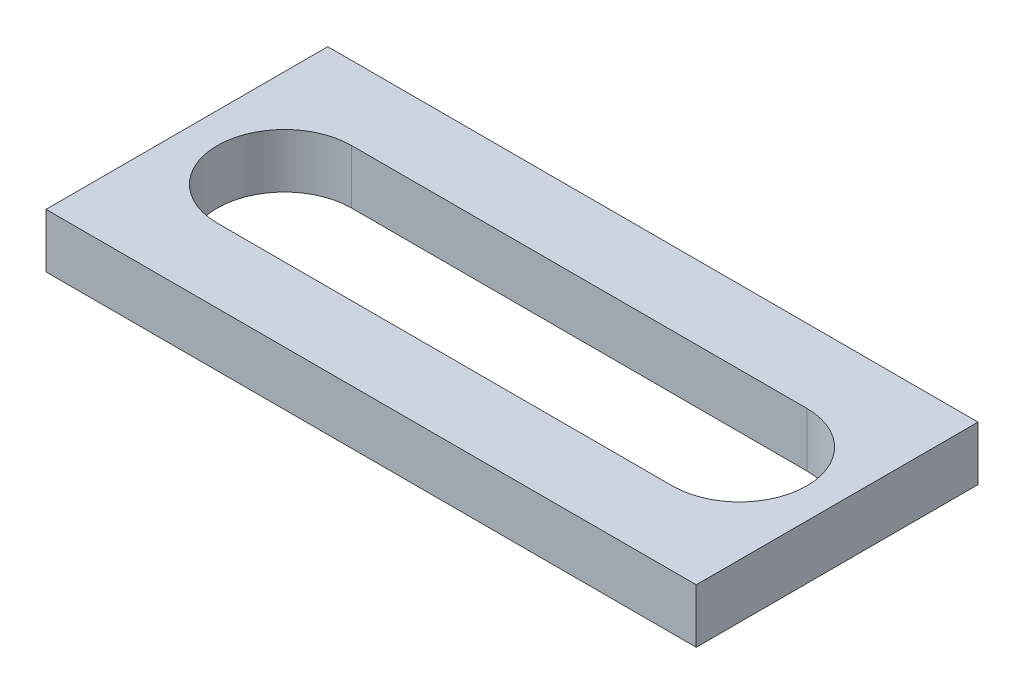
ISO-10303-21;
HEADER;
FILE_DESCRIPTION(('STEP AP214'),'2;1');
FILE_NAME('part.step','',(''),(''),'','','');
FILE_SCHEMA(('AUTOMOTIVE_DESIGN { 1 0 10303 214 1 1 1 1 }'));
ENDSEC;
DATA;
#1=APPLICATION_CONTEXT('core data for automotive mechanical design processes');
#2=APPLICATION_PROTOCOL_DEFINITION('international standard','automotive_design',2000,#1);
#3=PRODUCT_CONTEXT('',#1,'mechanical');
#4=PRODUCT('Part','Part','',(#3));
#5=PRODUCT_RELATED_PRODUCT_CATEGORY('part','',(#4));
#6=PRODUCT_DEFINITION_FORMATION('','',#4);
#7=PRODUCT_DEFINITION_CONTEXT('part definition',#1,'design');
#8=PRODUCT_DEFINITION('design','',#6,#7);
#9=PRODUCT_DEFINITION_SHAPE('','',#8);
#10=(LENGTH_UNIT() NAMED_UNIT(*) SI_UNIT(.MILLI.,.METRE.));
#11=(NAMED_UNIT(*) PLANE_ANGLE_UNIT() SI_UNIT($,.RADIAN.));
#12=(NAMED_UNIT(*) SI_UNIT($,.STERADIAN.) SOLID_ANGLE_UNIT());
#13=UNCERTAINTY_MEASURE_WITH_UNIT(LENGTH_MEASURE(1.E-05),#10,'distance_accuracy_value','');
#14=(GEOMETRIC_REPRESENTATION_CONTEXT(3) GLOBAL_UNCERTAINTY_ASSIGNED_CONTEXT((#13)) GLOBAL_UNIT_ASSIGNED_CONTEXT((#10,
#11,#12)) REPRESENTATION_CONTEXT('',''));
#15=CARTESIAN_POINT('',(0.,0.,0.));
#16=DIRECTION('',(0.,0.,1.));
#17=DIRECTION('',(1.,0.,0.));
#18=AXIS2_PLACEMENT_3D('',#15,#16,#17);
#19=CARTESIAN_POINT('',(0.,2.5,0.));
#20=DIRECTION('',(0.,1.,0.));
#21=DIRECTION('',(0.,0.,1.));
#22=AXIS2_PLACEMENT_3D('',#19,#20,#21);
#23=PLANE('',#22);
#24=DIRECTION('',(0.,0.,-1.));
#25=VECTOR('',#24,1.);
#26=CARTESIAN_POINT('',(15.,2.5,-6.5));
#27=LINE('',#26,#25);
#28=CARTESIAN_POINT('',(15.,2.5,6.5));
#29=VERTEX_POINT('',#28);
#30=CARTESIAN_POINT('',(15.,2.5,-6.5));
#31=VERTEX_POINT('',#30);
#32=EDGE_CURVE('E136',#29,#31,#27,.T.);
#33=ORIENTED_EDGE('',*,*,#32,.T.);
#34=DIRECTION('',(-1.,0.,0.));
#35=VECTOR('',#34,1.);
#36=CARTESIAN_POINT('',(-15.,2.5,-6.5));
#37=LINE('',#36,#35);
#38=CARTESIAN_POINT('',(-15.,2.5,-6.5));
#39=VERTEX_POINT('',#38);
#40=EDGE_CURVE('E139',#31,#39,#37,.T.);
#41=ORIENTED_EDGE('',*,*,#40,.T.);
#42=DIRECTION('',(0.,0.,1.));
#43=VECTOR('',#42,1.);
#44=CARTESIAN_POINT('',(-15.,2.5,-6.5));
#45=LINE('',#44,#43);
#46=CARTESIAN_POINT('',(-15.,2.5,6.5));
#47=VERTEX_POINT('',#46);
#48=EDGE_CURVE('E142',#39,#47,#45,.T.);
#49=ORIENTED_EDGE('',*,*,#48,.T.);
#50=DIRECTION('',(1.,0.,0.));
#51=VECTOR('',#50,1.);
#52=CARTESIAN_POINT('',(-15.,2.5,6.5));
#53=LINE('',#52,#51);
#54=EDGE_CURVE('E144',#47,#29,#53,.T.);
#55=ORIENTED_EDGE('',*,*,#54,.T.);
#56=EDGE_LOOP('',(#33,#41,#49,#55));
#57=FACE_BOUND('',#56,.T.);
#58=DIRECTION('',(1.,0.,0.));
#59=VECTOR('',#58,1.);
#60=CARTESIAN_POINT('',(-10.5,2.5,3.1));
#61=LINE('',#60,#59);
#62=CARTESIAN_POINT('',(-10.5,2.5,3.1));
#63=VERTEX_POINT('',#62);
#64=CARTESIAN_POINT('',(10.5,2.5,3.1));
#65=VERTEX_POINT('',#64);
#66=EDGE_CURVE('E108',#63,#65,#61,.T.);
#67=ORIENTED_EDGE('',*,*,#66,.F.);
#68=CARTESIAN_POINT('',(-10.5,2.5,0.));
#69=DIRECTION('',(0.,1.,0.));
#70=DIRECTION('',(0.,0.,1.));
#71=AXIS2_PLACEMENT_3D('',#68,#69,#70);
#72=CIRCLE('',#71,3.1);
#73=CARTESIAN_POINT('',(-10.5,2.5,-3.1));
#74=VERTEX_POINT('',#73);
#75=EDGE_CURVE('E100',#74,#63,#72,.T.);
#76=ORIENTED_EDGE('',*,*,#75,.F.);
#77=DIRECTION('',(-1.,0.,0.));
#78=VECTOR('',#77,1.);
#79=CARTESIAN_POINT('',(-10.5,2.5,-3.1));
#80=LINE('',#79,#78);
#81=CARTESIAN_POINT('',(10.5,2.5,-3.1));
#82=VERTEX_POINT('',#81);
#83=EDGE_CURVE('E122',#82,#74,#80,.T.);
#84=ORIENTED_EDGE('',*,*,#83,.F.);
#85=CARTESIAN_POINT('',(10.5,2.5,0.));
#86=DIRECTION('',(0.,1.,0.));
#87=DIRECTION('',(0.,0.,1.));
#88=AXIS2_PLACEMENT_3D('',#85,#86,#87);
#89=CIRCLE('',#88,3.1);
#90=EDGE_CURVE('E120',#65,#82,#89,.T.);
#91=ORIENTED_EDGE('',*,*,#90,.F.);
#92=EDGE_LOOP('',(#67,#76,#84,#91));
#93=FACE_BOUND('',#92,.T.);
#94=ADVANCED_FACE('F35',(#57,#93),#23,.T.);
#95=CARTESIAN_POINT('',(0.,0.,0.));
#96=DIRECTION('',(0.,1.,0.));
#97=DIRECTION('',(0.,0.,1.));
#98=AXIS2_PLACEMENT_3D('',#95,#96,#97);
#99=PLANE('',#98);
#100=DIRECTION('',(0.,0.,-1.));
#101=VECTOR('',#100,1.);
#102=CARTESIAN_POINT('',(15.,0.,-6.5));
#103=LINE('',#102,#101);
#104=CARTESIAN_POINT('',(15.,0.,6.5));
#105=VERTEX_POINT('',#104);
#106=CARTESIAN_POINT('',(15.,0.,-6.5));
#107=VERTEX_POINT('',#106);
#108=EDGE_CURVE('E116',#105,#107,#103,.T.);
#109=ORIENTED_EDGE('',*,*,#108,.F.);
#110=DIRECTION('',(1.,0.,0.));
#111=VECTOR('',#110,1.);
#112=CARTESIAN_POINT('',(-15.,0.,6.5));
#113=LINE('',#112,#111);
#114=CARTESIAN_POINT('',(-15.,0.,6.5));
#115=VERTEX_POINT('',#114);
#116=EDGE_CURVE('E140',#115,#105,#113,.T.);
#117=ORIENTED_EDGE('',*,*,#116,.F.);
#118=DIRECTION('',(0.,0.,1.));
#119=VECTOR('',#118,1.);
#120=CARTESIAN_POINT('',(-15.,0.,-6.5));
#121=LINE('',#120,#119);
#122=CARTESIAN_POINT('',(-15.,0.,-6.5));
#123=VERTEX_POINT('',#122);
#124=EDGE_CURVE('E151',#123,#115,#121,.T.);
#125=ORIENTED_EDGE('',*,*,#124,.F.);
#126=DIRECTION('',(-1.,0.,0.));
#127=VECTOR('',#126,1.);
#128=CARTESIAN_POINT('',(-15.,0.,-6.5));
#129=LINE('',#128,#127);
#130=EDGE_CURVE('E149',#107,#123,#129,.T.);
#131=ORIENTED_EDGE('',*,*,#130,.F.);
#132=EDGE_LOOP('',(#109,#117,#125,#131));
#133=FACE_BOUND('',#132,.T.);
#134=CARTESIAN_POINT('',(-10.5,0.,0.));
#135=DIRECTION('',(0.,1.,0.));
#136=DIRECTION('',(0.,0.,1.));
#137=AXIS2_PLACEMENT_3D('',#134,#135,#136);
#138=CIRCLE('',#137,3.1);
#139=CARTESIAN_POINT('',(-10.5,0.,-3.1));
#140=VERTEX_POINT('',#139);
#141=CARTESIAN_POINT('',(-10.5,0.,3.1));
#142=VERTEX_POINT('',#141);
#143=EDGE_CURVE('E58',#140,#142,#138,.T.);
#144=ORIENTED_EDGE('',*,*,#143,.T.);
#145=DIRECTION('',(1.,0.,0.));
#146=VECTOR('',#145,1.);
#147=CARTESIAN_POINT('',(-10.5,0.,3.1));
#148=LINE('',#147,#146);
#149=CARTESIAN_POINT('',(10.5,0.,3.1));
#150=VERTEX_POINT('',#149);
#151=EDGE_CURVE('E115',#142,#150,#148,.T.);
#152=ORIENTED_EDGE('',*,*,#151,.T.);
#153=CARTESIAN_POINT('',(10.5,0.,0.));
#154=DIRECTION('',(0.,1.,0.));
#155=DIRECTION('',(0.,0.,1.));
#156=AXIS2_PLACEMENT_3D('',#153,#154,#155);
#157=CIRCLE('',#156,3.1);
#158=CARTESIAN_POINT('',(10.5,0.,-3.1));
#159=VERTEX_POINT('',#158);
#160=EDGE_CURVE('E128',#150,#159,#157,.T.);
#161=ORIENTED_EDGE('',*,*,#160,.T.);
#162=DIRECTION('',(-1.,0.,0.));
#163=VECTOR('',#162,1.);
#164=CARTESIAN_POINT('',(-10.5,0.,-3.1));
#165=LINE('',#164,#163);
#166=EDGE_CURVE('E109',#159,#140,#165,.T.);
#167=ORIENTED_EDGE('',*,*,#166,.T.);
#168=EDGE_LOOP('',(#144,#152,#161,#167));
#169=FACE_BOUND('',#168,.T.);
#170=ADVANCED_FACE('F169',(#133,#169),#99,.F.);
#171=CARTESIAN_POINT('',(15.,2.5,-6.5));
#172=DIRECTION('',(-1.,0.,0.));
#173=DIRECTION('',(0.,0.,1.));
#174=AXIS2_PLACEMENT_3D('',#171,#172,#173);
#175=PLANE('',#174);
#176=ORIENTED_EDGE('',*,*,#108,.T.);
#177=DIRECTION('',(0.,-1.,0.));
#178=VECTOR('',#177,1.);
#179=CARTESIAN_POINT('',(15.,2.5,-6.5));
#180=LINE('',#179,#178);
#181=EDGE_CURVE('E11',#31,#107,#180,.T.);
#182=ORIENTED_EDGE('',*,*,#181,.F.);
#183=ORIENTED_EDGE('',*,*,#32,.F.);
#184=DIRECTION('',(0.,-1.,0.));
#185=VECTOR('',#184,1.);
#186=CARTESIAN_POINT('',(15.,2.5,6.5));
#187=LINE('',#186,#185);
#188=EDGE_CURVE('E146',#29,#105,#187,.T.);
#189=ORIENTED_EDGE('',*,*,#188,.T.);
#190=EDGE_LOOP('',(#176,#182,#183,#189));
#191=FACE_BOUND('',#190,.T.);
#192=ADVANCED_FACE('F37',(#191),#175,.F.);
#193=CARTESIAN_POINT('',(-15.,2.5,-6.5));
#194=DIRECTION('',(0.,0.,1.));
#195=DIRECTION('',(1.,0.,0.));
#196=AXIS2_PLACEMENT_3D('',#193,#194,#195);
#197=PLANE('',#196);
#198=ORIENTED_EDGE('',*,*,#130,.T.);
#199=DIRECTION('',(0.,-1.,0.));
#200=VECTOR('',#199,1.);
#201=CARTESIAN_POINT('',(-15.,2.5,-6.5));
#202=LINE('',#201,#200);
#203=EDGE_CURVE('E43',#39,#123,#202,.T.);
#204=ORIENTED_EDGE('',*,*,#203,.F.);
#205=ORIENTED_EDGE('',*,*,#40,.F.);
#206=ORIENTED_EDGE('',*,*,#181,.T.);
#207=EDGE_LOOP('',(#198,#204,#205,#206));
#208=FACE_BOUND('',#207,.T.);
#209=ADVANCED_FACE('F179',(#208),#197,.F.);
#210=CARTESIAN_POINT('',(-15.,2.5,-6.5));
#211=DIRECTION('',(1.,0.,0.));
#212=DIRECTION('',(0.,0.,-1.));
#213=AXIS2_PLACEMENT_3D('',#210,#211,#212);
#214=PLANE('',#213);
#215=ORIENTED_EDGE('',*,*,#124,.T.);
#216=DIRECTION('',(0.,-1.,0.));
#217=VECTOR('',#216,1.);
#218=CARTESIAN_POINT('',(-15.,2.5,6.5));
#219=LINE('',#218,#217);
#220=EDGE_CURVE('E156',#47,#115,#219,.T.);
#221=ORIENTED_EDGE('',*,*,#220,.F.);
#222=ORIENTED_EDGE('',*,*,#48,.F.);
#223=ORIENTED_EDGE('',*,*,#203,.T.);
#224=EDGE_LOOP('',(#215,#221,#222,#223));
#225=FACE_BOUND('',#224,.T.);
#226=ADVANCED_FACE('F163',(#225),#214,.F.);
#227=CARTESIAN_POINT('',(-15.,2.5,6.5));
#228=DIRECTION('',(0.,0.,-1.));
#229=DIRECTION('',(-1.,0.,0.));
#230=AXIS2_PLACEMENT_3D('',#227,#228,#229);
#231=PLANE('',#230);
#232=ORIENTED_EDGE('',*,*,#116,.T.);
#233=ORIENTED_EDGE('',*,*,#188,.F.);
#234=ORIENTED_EDGE('',*,*,#54,.F.);
#235=ORIENTED_EDGE('',*,*,#220,.T.);
#236=EDGE_LOOP('',(#232,#233,#234,#235));
#237=FACE_BOUND('',#236,.T.);
#238=ADVANCED_FACE('F173',(#237),#231,.F.);
#239=CARTESIAN_POINT('',(-10.5,2.5,0.));
#240=DIRECTION('',(0.,-1.,0.));
#241=DIRECTION('',(0.,0.,-1.));
#242=AXIS2_PLACEMENT_3D('',#239,#240,#241);
#243=CYLINDRICAL_SURFACE('',#242,3.1);
#244=ORIENTED_EDGE('',*,*,#143,.F.);
#245=DIRECTION('',(0.,-1.,0.));
#246=VECTOR('',#245,1.);
#247=CARTESIAN_POINT('',(-10.5,2.5,-3.1));
#248=LINE('',#247,#246);
#249=EDGE_CURVE('E104',#74,#140,#248,.T.);
#250=ORIENTED_EDGE('',*,*,#249,.F.);
#251=ORIENTED_EDGE('',*,*,#75,.T.);
#252=DIRECTION('',(0.,-1.,0.));
#253=VECTOR('',#252,1.);
#254=CARTESIAN_POINT('',(-10.5,2.5,3.1));
#255=LINE('',#254,#253);
#256=EDGE_CURVE('E103',#63,#142,#255,.T.);
#257=ORIENTED_EDGE('',*,*,#256,.T.);
#258=EDGE_LOOP('',(#244,#250,#251,#257));
#259=FACE_BOUND('',#258,.T.);
#260=ADVANCED_FACE('F102',(#259),#243,.F.);
#261=CARTESIAN_POINT('',(-10.5,2.5,3.1));
#262=DIRECTION('',(0.,0.,-1.));
#263=DIRECTION('',(-1.,0.,0.));
#264=AXIS2_PLACEMENT_3D('',#261,#262,#263);
#265=PLANE('',#264);
#266=ORIENTED_EDGE('',*,*,#151,.F.);
#267=ORIENTED_EDGE('',*,*,#256,.F.);
#268=ORIENTED_EDGE('',*,*,#66,.T.);
#269=DIRECTION('',(0.,-1.,0.));
#270=VECTOR('',#269,1.);
#271=CARTESIAN_POINT('',(10.5,2.5,3.1));
#272=LINE('',#271,#270);
#273=EDGE_CURVE('E117',#65,#150,#272,.T.);
#274=ORIENTED_EDGE('',*,*,#273,.T.);
#275=EDGE_LOOP('',(#266,#267,#268,#274));
#276=FACE_BOUND('',#275,.T.);
#277=ADVANCED_FACE('F112',(#276),#265,.T.);
#278=CARTESIAN_POINT('',(10.5,2.5,0.));
#279=DIRECTION('',(0.,-1.,0.));
#280=DIRECTION('',(0.,0.,-1.));
#281=AXIS2_PLACEMENT_3D('',#278,#279,#280);
#282=CYLINDRICAL_SURFACE('',#281,3.1);
#283=ORIENTED_EDGE('',*,*,#160,.F.);
#284=ORIENTED_EDGE('',*,*,#273,.F.);
#285=ORIENTED_EDGE('',*,*,#90,.T.);
#286=DIRECTION('',(0.,-1.,0.));
#287=VECTOR('',#286,1.);
#288=CARTESIAN_POINT('',(10.5,2.5,-3.1));
#289=LINE('',#288,#287);
#290=EDGE_CURVE('E50',#82,#159,#289,.T.);
#291=ORIENTED_EDGE('',*,*,#290,.T.);
#292=EDGE_LOOP('',(#283,#284,#285,#291));
#293=FACE_BOUND('',#292,.T.);
#294=ADVANCED_FACE('F202',(#293),#282,.F.);
#295=CARTESIAN_POINT('',(-10.5,2.5,-3.1));
#296=DIRECTION('',(0.,0.,1.));
#297=DIRECTION('',(1.,0.,0.));
#298=AXIS2_PLACEMENT_3D('',#295,#296,#297);
#299=PLANE('',#298);
#300=ORIENTED_EDGE('',*,*,#166,.F.);
#301=ORIENTED_EDGE('',*,*,#290,.F.);
#302=ORIENTED_EDGE('',*,*,#83,.T.);
#303=ORIENTED_EDGE('',*,*,#249,.T.);
#304=EDGE_LOOP('',(#300,#301,#302,#303));
#305=FACE_BOUND('',#304,.T.);
#306=ADVANCED_FACE('F206',(#305),#299,.T.);
#307=CLOSED_SHELL('',(#94,#170,#192,#209,#226,#238,#260,#277,#294,#306));
#308=MANIFOLD_SOLID_BREP('B2',#307);
#309=ADVANCED_BREP_SHAPE_REPRESENTATION('',(#18,#308),#14);
#310=SHAPE_DEFINITION_REPRESENTATION(#9,#309);
ENDSEC;
END-ISO-10303-21;
